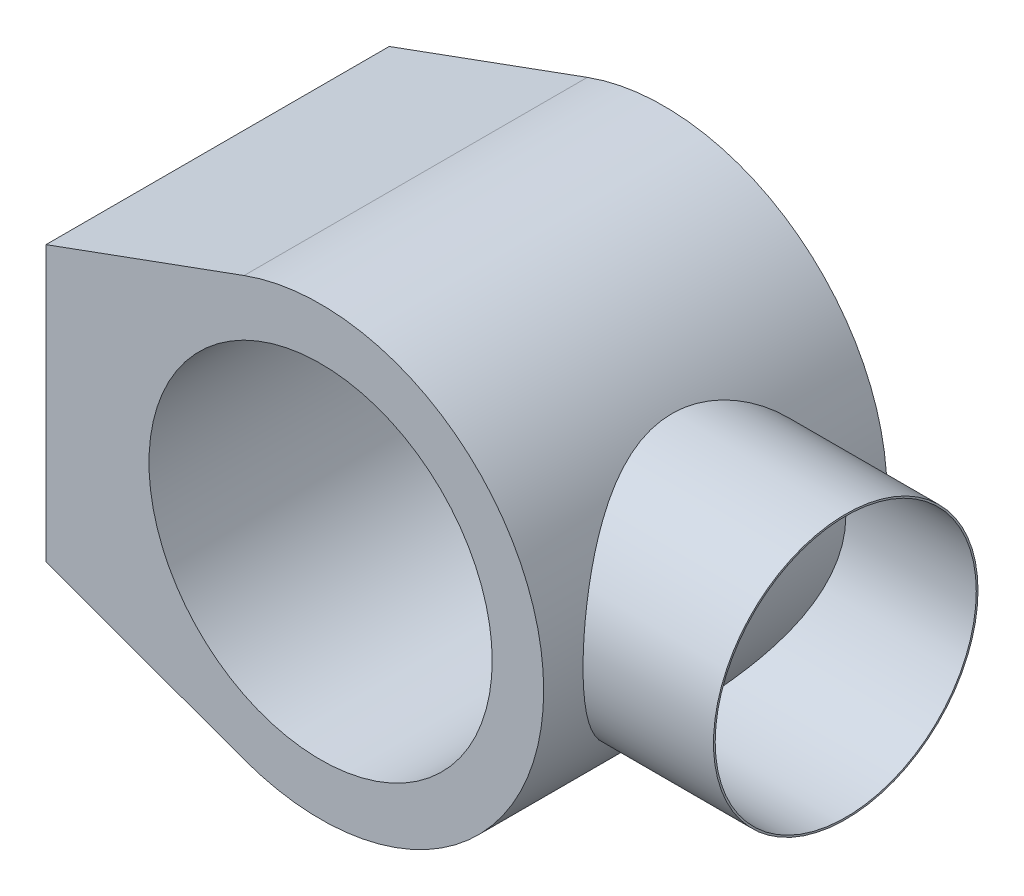
ISO-10303-21;
HEADER;
FILE_DESCRIPTION(('STEP AP214'),'2;1');
FILE_NAME('part.step','',(''),(''),'','','');
FILE_SCHEMA(('AUTOMOTIVE_DESIGN { 1 0 10303 214 1 1 1 1 }'));
ENDSEC;
DATA;
#1=APPLICATION_CONTEXT('core data for automotive mechanical design processes');
#2=APPLICATION_PROTOCOL_DEFINITION('international standard','automotive_design',2000,#1);
#3=PRODUCT_CONTEXT('',#1,'mechanical');
#4=PRODUCT('Part','Part','',(#3));
#5=PRODUCT_RELATED_PRODUCT_CATEGORY('part','',(#4));
#6=PRODUCT_DEFINITION_FORMATION('','',#4);
#7=PRODUCT_DEFINITION_CONTEXT('part definition',#1,'design');
#8=PRODUCT_DEFINITION('design','',#6,#7);
#9=PRODUCT_DEFINITION_SHAPE('','',#8);
#10=(LENGTH_UNIT() NAMED_UNIT(*) SI_UNIT(.MILLI.,.METRE.));
#11=(NAMED_UNIT(*) PLANE_ANGLE_UNIT() SI_UNIT($,.RADIAN.));
#12=(NAMED_UNIT(*) SI_UNIT($,.STERADIAN.) SOLID_ANGLE_UNIT());
#13=UNCERTAINTY_MEASURE_WITH_UNIT(LENGTH_MEASURE(1.E-05),#10,'distance_accuracy_value','');
#14=(GEOMETRIC_REPRESENTATION_CONTEXT(3) GLOBAL_UNCERTAINTY_ASSIGNED_CONTEXT((#13)) GLOBAL_UNIT_ASSIGNED_CONTEXT((#10,
#11,#12)) REPRESENTATION_CONTEXT('',''));
#15=CARTESIAN_POINT('',(0.,0.,0.));
#16=DIRECTION('',(0.,0.,1.));
#17=DIRECTION('',(1.,0.,0.));
#18=AXIS2_PLACEMENT_3D('',#15,#16,#17);
#19=CARTESIAN_POINT('',(0.,0.,50.));
#20=DIRECTION('',(0.,0.,1.));
#21=DIRECTION('',(1.,0.,0.));
#22=AXIS2_PLACEMENT_3D('',#19,#20,#21);
#23=PLANE('',#22);
#24=DIRECTION('',(0.939410286372225,-0.342794856813887,0.));
#25=VECTOR('',#24,1.);
#26=CARTESIAN_POINT('',(-80.,-40.,50.));
#27=LINE('',#26,#25);
#28=CARTESIAN_POINT('',(-80.,-40.,50.));
#29=VERTEX_POINT('',#28);
#30=CARTESIAN_POINT('',(-22.2816656929027,-61.0616686141946,50.));
#31=VERTEX_POINT('',#30);
#32=EDGE_CURVE('E290',#29,#31,#27,.T.);
#33=ORIENTED_EDGE('',*,*,#32,.T.);
#34=CARTESIAN_POINT('',(0.,0.,50.));
#35=DIRECTION('',(0.,0.,1.));
#36=DIRECTION('',(1.,0.,0.));
#37=AXIS2_PLACEMENT_3D('',#34,#35,#36);
#38=CIRCLE('',#37,65.);
#39=CARTESIAN_POINT('',(-22.2816656929027,61.0616686141947,50.));
#40=VERTEX_POINT('',#39);
#41=EDGE_CURVE('E285',#31,#40,#38,.T.);
#42=ORIENTED_EDGE('',*,*,#41,.T.);
#43=DIRECTION('',(-0.939410286372226,-0.342794856813887,0.));
#44=VECTOR('',#43,1.);
#45=CARTESIAN_POINT('',(-80.,40.,50.));
#46=LINE('',#45,#44);
#47=CARTESIAN_POINT('',(-80.,40.,50.));
#48=VERTEX_POINT('',#47);
#49=EDGE_CURVE('E288',#40,#48,#46,.T.);
#50=ORIENTED_EDGE('',*,*,#49,.T.);
#51=DIRECTION('',(0.,-1.,0.));
#52=VECTOR('',#51,1.);
#53=CARTESIAN_POINT('',(-80.,40.,50.));
#54=LINE('',#53,#52);
#55=EDGE_CURVE('E254',#48,#29,#54,.T.);
#56=ORIENTED_EDGE('',*,*,#55,.T.);
#57=EDGE_LOOP('',(#33,#42,#50,#56));
#58=FACE_BOUND('',#57,.T.);
#59=CARTESIAN_POINT('',(0.,0.,50.));
#60=DIRECTION('',(0.,0.,1.));
#61=DIRECTION('',(1.,0.,0.));
#62=AXIS2_PLACEMENT_3D('',#59,#60,#61);
#63=CIRCLE('',#62,50.);
#64=CARTESIAN_POINT('',(50.,0.,50.));
#65=VERTEX_POINT('',#64);
#66=EDGE_CURVE('E307',#65,#65,#63,.T.);
#67=ORIENTED_EDGE('',*,*,#66,.F.);
#68=EDGE_LOOP('',(#67));
#69=FACE_BOUND('',#68,.T.);
#70=ADVANCED_FACE('F233',(#58,#69),#23,.T.);
#71=CARTESIAN_POINT('',(0.,0.,-50.));
#72=DIRECTION('',(0.,0.,1.));
#73=DIRECTION('',(1.,0.,0.));
#74=AXIS2_PLACEMENT_3D('',#71,#72,#73);
#75=PLANE('',#74);
#76=DIRECTION('',(0.939410286372225,-0.342794856813887,0.));
#77=VECTOR('',#76,1.);
#78=CARTESIAN_POINT('',(-80.,-40.,-50.));
#79=LINE('',#78,#77);
#80=CARTESIAN_POINT('',(-80.,-40.,-50.));
#81=VERTEX_POINT('',#80);
#82=CARTESIAN_POINT('',(-22.2816656929027,-61.0616686141946,-50.));
#83=VERTEX_POINT('',#82);
#84=EDGE_CURVE('E304',#81,#83,#79,.T.);
#85=ORIENTED_EDGE('',*,*,#84,.F.);
#86=DIRECTION('',(0.,-1.,0.));
#87=VECTOR('',#86,1.);
#88=CARTESIAN_POINT('',(-80.,40.,-50.));
#89=LINE('',#88,#87);
#90=CARTESIAN_POINT('',(-80.,40.,-50.));
#91=VERTEX_POINT('',#90);
#92=EDGE_CURVE('E277',#91,#81,#89,.T.);
#93=ORIENTED_EDGE('',*,*,#92,.F.);
#94=DIRECTION('',(-0.939410286372226,-0.342794856813887,0.));
#95=VECTOR('',#94,1.);
#96=CARTESIAN_POINT('',(-80.,40.,-50.));
#97=LINE('',#96,#95);
#98=CARTESIAN_POINT('',(-22.2816656929027,61.0616686141947,-50.));
#99=VERTEX_POINT('',#98);
#100=EDGE_CURVE('E271',#99,#91,#97,.T.);
#101=ORIENTED_EDGE('',*,*,#100,.F.);
#102=CARTESIAN_POINT('',(0.,0.,-50.));
#103=DIRECTION('',(0.,0.,1.));
#104=DIRECTION('',(1.,0.,0.));
#105=AXIS2_PLACEMENT_3D('',#102,#103,#104);
#106=CIRCLE('',#105,65.);
#107=EDGE_CURVE('E295',#83,#99,#106,.T.);
#108=ORIENTED_EDGE('',*,*,#107,.F.);
#109=EDGE_LOOP('',(#85,#93,#101,#108));
#110=FACE_BOUND('',#109,.T.);
#111=CARTESIAN_POINT('',(0.,0.,-50.));
#112=DIRECTION('',(0.,0.,1.));
#113=DIRECTION('',(1.,0.,0.));
#114=AXIS2_PLACEMENT_3D('',#111,#112,#113);
#115=CIRCLE('',#114,50.);
#116=CARTESIAN_POINT('',(50.,0.,-50.));
#117=VERTEX_POINT('',#116);
#118=EDGE_CURVE('E321',#117,#117,#115,.T.);
#119=ORIENTED_EDGE('',*,*,#118,.T.);
#120=EDGE_LOOP('',(#119));
#121=FACE_BOUND('',#120,.T.);
#122=ADVANCED_FACE('F315',(#110,#121),#75,.F.);
#123=CARTESIAN_POINT('',(-80.,-40.,50.));
#124=DIRECTION('',(0.342794856813887,0.939410286372225,0.));
#125=DIRECTION('',(-0.939410286372225,0.342794856813887,0.));
#126=AXIS2_PLACEMENT_3D('',#123,#124,#125);
#127=PLANE('',#126);
#128=ORIENTED_EDGE('',*,*,#84,.T.);
#129=DIRECTION('',(0.,0.,-1.));
#130=VECTOR('',#129,1.);
#131=CARTESIAN_POINT('',(-22.2816656929027,-61.0616686141946,50.));
#132=LINE('',#131,#130);
#133=EDGE_CURVE('E246',#31,#83,#132,.T.);
#134=ORIENTED_EDGE('',*,*,#133,.F.);
#135=ORIENTED_EDGE('',*,*,#32,.F.);
#136=DIRECTION('',(0.,0.,-1.));
#137=VECTOR('',#136,1.);
#138=CARTESIAN_POINT('',(-80.,-40.,50.));
#139=LINE('',#138,#137);
#140=EDGE_CURVE('E300',#29,#81,#139,.T.);
#141=ORIENTED_EDGE('',*,*,#140,.T.);
#142=EDGE_LOOP('',(#128,#134,#135,#141));
#143=FACE_BOUND('',#142,.T.);
#144=ADVANCED_FACE('F235',(#143),#127,.F.);
#145=CARTESIAN_POINT('',(0.,0.,50.));
#146=DIRECTION('',(0.,0.,-1.));
#147=DIRECTION('',(-1.,0.,0.));
#148=AXIS2_PLACEMENT_3D('',#145,#146,#147);
#149=CYLINDRICAL_SURFACE('',#148,65.);
#150=CARTESIAN_POINT('',(65.,0.,-38.535));
#151=CARTESIAN_POINT('',(64.9999911949424,0.987976831353311,-38.5349902511514));
#152=CARTESIAN_POINT('',(64.9774152738882,1.97627275869706,-38.4969424597008));
#153=CARTESIAN_POINT('',(64.8876432189488,3.94543171340727,-38.3452225097814));
#154=CARTESIAN_POINT('',(64.8204190907879,4.92628968670687,-38.2315029052557));
#155=CARTESIAN_POINT('',(64.6428292345888,6.87486862388316,-37.9296260718127));
#156=CARTESIAN_POINT('',(64.5323640065708,7.84255392412636,-37.7412971509091));
#157=CARTESIAN_POINT('',(64.2710340997559,9.75530492921842,-37.2926969034477));
#158=CARTESIAN_POINT('',(64.1201753775438,10.7003739467875,-37.0324361840559));
#159=CARTESIAN_POINT('',(63.7824439438179,12.5573127748817,-36.4445325274687));
#160=CARTESIAN_POINT('',(63.5957538140062,13.4693241562554,-36.1172306583173));
#161=CARTESIAN_POINT('',(63.1900028197763,15.2599625528183,-35.3978935127097));
#162=CARTESIAN_POINT('',(62.9709408812313,16.1385884590296,-35.0058560882165));
#163=CARTESIAN_POINT('',(62.5051306064847,17.8578155326083,-34.1608224192051));
#164=CARTESIAN_POINT('',(62.258394169682,18.6984328263064,-33.7078523577501));
#165=CARTESIAN_POINT('',(61.7420488725879,20.3386024777687,-32.7443468133726));
#166=CARTESIAN_POINT('',(61.4724391569129,21.1381532979886,-32.2338091773819));
#167=CARTESIAN_POINT('',(60.8944485800029,22.752035334423,-31.1179179444586));
#168=CARTESIAN_POINT('',(60.5846772078036,23.5629321203387,-30.5083171571327));
#169=CARTESIAN_POINT('',(59.9512104449879,25.1310078287554,-29.2301554735673));
#170=CARTESIAN_POINT('',(59.6275144519006,25.888184423204,-28.5615920248973));
#171=CARTESIAN_POINT('',(58.9726752175314,27.347095337709,-27.1680220973247));
#172=CARTESIAN_POINT('',(58.6415235718192,28.0487626041554,-26.4429493931147));
#173=CARTESIAN_POINT('',(57.9793309358277,29.3931758548013,-24.940010876701));
#174=CARTESIAN_POINT('',(57.6482899523926,30.0359186942767,-24.1621422506953));
#175=CARTESIAN_POINT('',(56.9548534740239,31.332854524002,-22.4605244205008));
#176=CARTESIAN_POINT('',(56.59342401092,31.9792803253426,-21.5304385797799));
#177=CARTESIAN_POINT('',(55.8914135552976,33.1909683917639,-19.6110682249147));
#178=CARTESIAN_POINT('',(55.5508358856725,33.7562177399664,-18.6217743249282));
#179=CARTESIAN_POINT('',(54.9030315892671,34.7999137155156,-16.5896122167423));
#180=CARTESIAN_POINT('',(54.595762148095,35.2784723194759,-15.5468153851819));
#181=CARTESIAN_POINT('',(54.0266654398783,36.143990706523,-13.4120636687325));
#182=CARTESIAN_POINT('',(53.7648217458336,36.5309836203778,-12.3201267346954));
#183=CARTESIAN_POINT('',(53.3539859684097,37.1274886194685,-10.3578312103774));
#184=CARTESIAN_POINT('',(53.1929493804508,37.3573298419664,-9.49612757765819));
#185=CARTESIAN_POINT('',(52.9095509002482,37.7576449243597,-7.75279893885493));
#186=CARTESIAN_POINT('',(52.7871831120935,37.9281278351426,-6.87117699174275));
#187=CARTESIAN_POINT('',(52.585424148517,38.2073674275062,-5.09424243371309));
#188=CARTESIAN_POINT('',(52.5059890550397,38.3161871930235,-4.19894478038054));
#189=CARTESIAN_POINT('',(52.3928244581682,38.470783862046,-2.39999272392233));
#190=CARTESIAN_POINT('',(52.3590957784487,38.5165596294362,-1.49633817049252));
#191=CARTESIAN_POINT('',(52.3386250056153,38.5443725132486,0.314119950689428));
#192=CARTESIAN_POINT('',(52.3519676509242,38.5262946795012,1.22092625870764));
#193=CARTESIAN_POINT('',(52.425309688552,38.4264320661922,3.02910272984153));
#194=CARTESIAN_POINT('',(52.4853092987791,38.3446469890902,3.93047286754814));
#195=CARTESIAN_POINT('',(52.6497496558937,38.1185427067294,5.72175599350346));
#196=CARTESIAN_POINT('',(52.7542183455826,37.9741841814769,6.61166141487832));
#197=CARTESIAN_POINT('',(53.0038756591501,37.624926610728,8.37364296759673));
#198=CARTESIAN_POINT('',(53.1490652346887,37.4200261503412,9.24571868174327));
#199=CARTESIAN_POINT('',(53.4736705035497,36.9546485442773,10.9580619180162));
#200=CARTESIAN_POINT('',(53.6527074780226,36.6947829052219,11.7985684806562));
#201=CARTESIAN_POINT('',(54.0407872995581,36.1208142055593,13.453633748011));
#202=CARTESIAN_POINT('',(54.249829638269,35.8067120638101,14.2681928920421));
#203=CARTESIAN_POINT('',(54.6925622377679,35.1267444450613,15.8686557781167));
#204=CARTESIAN_POINT('',(54.9262580449052,34.7608673137721,16.6545530182791));
#205=CARTESIAN_POINT('',(55.4128738742391,33.979775448213,18.1952523282263));
#206=CARTESIAN_POINT('',(55.6657954137918,33.5645568182948,18.9500519364224));
#207=CARTESIAN_POINT('',(56.2301672857619,32.6117313991161,20.5531810573438));
#208=CARTESIAN_POINT('',(56.5442222783176,32.0653433324212,21.3953855691914));
#209=CARTESIAN_POINT('',(57.1835162711493,30.9108544286079,23.0318967649082));
#210=CARTESIAN_POINT('',(57.5087562291142,30.3027482982696,23.826199331161));
#211=CARTESIAN_POINT('',(58.1631348258033,29.0269543811981,25.3649714268417));
#212=CARTESIAN_POINT('',(58.4922765320987,28.3592165874688,26.1093981974321));
#213=CARTESIAN_POINT('',(59.1470182420437,26.9670549755447,27.5449452888638));
#214=CARTESIAN_POINT('',(59.4726180550154,26.2426281225284,28.2360627518788));
#215=CARTESIAN_POINT('',(60.1560116268375,24.6396150029807,29.6500315716697));
#216=CARTESIAN_POINT('',(60.512336842441,23.7533334216756,30.3649040735003));
#217=CARTESIAN_POINT('',(61.2021030720994,21.9149829069974,31.7172172151811));
#218=CARTESIAN_POINT('',(61.5355417542829,20.9629072897518,32.3546499699018));
#219=CARTESIAN_POINT('',(62.1702161885582,18.9981418968875,33.5460286932068));
#220=CARTESIAN_POINT('',(62.471464630969,17.9854762550367,34.1000075972592));
#221=CARTESIAN_POINT('',(63.033180262524,15.9052910760494,35.1184927464048));
#222=CARTESIAN_POINT('',(63.2936525345319,14.8377783978186,35.5830101447897));
#223=CARTESIAN_POINT('',(63.7505229620954,12.7263777457139,36.3892618404304));
#224=CARTESIAN_POINT('',(63.9499815589726,11.6854496494908,36.7370064395608));
#225=CARTESIAN_POINT('',(64.3005658226089,9.57006954796787,37.3439479527016));
#226=CARTESIAN_POINT('',(64.4516929865986,8.49561858228491,37.60314760971));
#227=CARTESIAN_POINT('',(64.7009095521158,6.32346568867483,38.0287216155453));
#228=CARTESIAN_POINT('',(64.7990493321286,5.22578688071405,38.1951841402899));
#229=CARTESIAN_POINT('',(64.9393877775687,3.01666035850831,38.4327935417035));
#230=CARTESIAN_POINT('',(64.9815938780368,1.9052144940919,38.5039530866307));
#231=CARTESIAN_POINT('',(65.0069469332665,-0.172962373037184,38.5467167764841));
#232=CARTESIAN_POINT('',(64.9971680793765,-1.13938702649722,38.5302455835157));
#233=CARTESIAN_POINT('',(64.9347674364242,-3.06681472572754,38.424889182589));
#234=CARTESIAN_POINT('',(64.8821502070854,-4.02781833755292,38.336011681569));
#235=CARTESIAN_POINT('',(64.7353523384021,-5.93727243395648,38.0870337039576));
#236=CARTESIAN_POINT('',(64.6411726523484,-6.88572320593708,37.926934860923));
#237=CARTESIAN_POINT('',(64.4134755856428,-8.76348661994124,37.5375410984916));
#238=CARTESIAN_POINT('',(64.2799571652862,-9.69279875544484,37.3082443502222));
#239=CARTESIAN_POINT('',(63.9797530559851,-11.5073685588892,36.7885719627438));
#240=CARTESIAN_POINT('',(63.8138087666919,-12.3931396073621,36.4995545779764));
#241=CARTESIAN_POINT('',(63.4505545973374,-14.1357468665415,35.8606767818825));
#242=CARTESIAN_POINT('',(63.2532455817741,-14.9925838739607,35.5108180474855));
#243=CARTESIAN_POINT('',(62.8311229814591,-16.6733600456623,34.7533470425395));
#244=CARTESIAN_POINT('',(62.6063067578894,-17.497296043617,34.3457292304598));
#245=CARTESIAN_POINT('',(62.13338151108,-19.1088533110999,33.4759098638419));
#246=CARTESIAN_POINT('',(61.8852710483267,-19.8964723318577,33.0137049355288));
#247=CARTESIAN_POINT('',(61.3433602974475,-21.5126028675456,31.9869286213026));
#248=CARTESIAN_POINT('',(61.0474924496615,-22.336835493304,31.4167096882254));
#249=CARTESIAN_POINT('',(60.4389614761619,-23.93455429077,30.2172370252016));
#250=CARTESIAN_POINT('',(60.1262973678833,-24.7080374877924,29.5879798399631));
#251=CARTESIAN_POINT('',(59.4902751451785,-26.202428832304,28.273141132615));
#252=CARTESIAN_POINT('',(59.166905938001,-26.9232797949273,27.587500019294));
#253=CARTESIAN_POINT('',(58.5165022607872,-28.3090968942259,26.1634949973498));
#254=CARTESIAN_POINT('',(58.1894676135919,-28.9740603164152,25.4251285310475));
#255=CARTESIAN_POINT('',(57.4977754958128,-30.325769571008,23.8022084907858));
#256=CARTESIAN_POINT('',(57.1335637045106,-31.0047220663502,22.9109524486797));
#257=CARTESIAN_POINT('',(56.4199743194738,-32.2850401574689,21.0684847655453));
#258=CARTESIAN_POINT('',(56.070599063944,-32.8863935540226,20.1172637324254));
#259=CARTESIAN_POINT('',(55.3983851108793,-34.0065475327486,18.1596135414526));
#260=CARTESIAN_POINT('',(55.0755227704455,-34.5254220605492,17.1532349358583));
#261=CARTESIAN_POINT('',(54.4680273628646,-35.4760823807614,15.089194818302));
#262=CARTESIAN_POINT('',(54.1833825688909,-35.9078949081258,14.0315491735231));
#263=CARTESIAN_POINT('',(53.7205950366889,-36.5954960085083,12.1047197376352));
#264=CARTESIAN_POINT('',(53.5327308586644,-36.8691574322931,11.2442162752271));
#265=CARTESIAN_POINT('',(53.1936119065039,-37.35676634061,9.49938852608433));
#266=CARTESIAN_POINT('',(53.0423521450732,-37.5707219605735,8.61506750272139));
#267=CARTESIAN_POINT('',(52.781652512638,-37.9360991744812,6.82853516326083));
#268=CARTESIAN_POINT('',(52.6721654193987,-38.0875913963901,5.92634526859163));
#269=CARTESIAN_POINT('',(52.4987672374539,-38.3262484778434,4.1090907296477));
#270=CARTESIAN_POINT('',(52.4348565311965,-38.4134127975892,3.19402597740104));
#271=CARTESIAN_POINT('',(52.3549677413944,-38.5222273797041,1.35483975428445));
#272=CARTESIAN_POINT('',(52.3391494122421,-38.543659292683,0.430698306644773));
#273=CARTESIAN_POINT('',(52.3565355388121,-38.5200387303254,-1.41626769469411));
#274=CARTESIAN_POINT('',(52.3897401243943,-38.474986078874,-2.33909224489842));
#275=CARTESIAN_POINT('',(52.5038703449959,-38.3190923556067,-4.17661321974098));
#276=CARTESIAN_POINT('',(52.5848199299263,-38.2082182661701,-5.09130533106577));
#277=CARTESIAN_POINT('',(52.791349386482,-37.9223468202672,-6.90544254589293));
#278=CARTESIAN_POINT('',(52.9169296178298,-37.7473489469638,-7.80488752644245));
#279=CARTESIAN_POINT('',(53.2023861828065,-37.3438684628,-9.54720988231049));
#280=CARTESIAN_POINT('',(53.360689161589,-37.1178061243641,-10.3909106476192));
#281=CARTESIAN_POINT('',(53.709514483391,-36.6112349072273,-12.0548775666491));
#282=CARTESIAN_POINT('',(53.9000356504713,-36.3307280156555,-12.8751445744076));
#283=CARTESIAN_POINT('',(54.3081955438559,-35.7177188917479,-14.4891788837883));
#284=CARTESIAN_POINT('',(54.5258399785147,-35.3852057104163,-15.2829405623865));
#285=CARTESIAN_POINT('',(54.9830147548226,-34.6705630384109,-16.8414141395256));
#286=CARTESIAN_POINT('',(55.2225478235101,-34.2884273629172,-17.6061224015411));
#287=CARTESIAN_POINT('',(55.6135053276522,-33.6483790725803,-18.7876235738843));
#288=CARTESIAN_POINT('',(55.7593888213826,-33.4062109256189,-19.2148828398224));
#289=CARTESIAN_POINT('',(56.0557259084272,-32.906533837033,-20.0585787093483));
#290=CARTESIAN_POINT('',(56.2061785844451,-32.6490279647186,-20.4750174544887));
#291=CARTESIAN_POINT('',(56.6630598112528,-31.8539042823748,-21.7078668433497));
#292=CARTESIAN_POINT('',(56.9750122968427,-31.2936792139708,-22.5078128390879));
#293=CARTESIAN_POINT('',(57.6064987610449,-30.1154188416892,-24.061571703847));
#294=CARTESIAN_POINT('',(57.9260379383009,-29.4973429902626,-24.8153515935825));
#295=CARTESIAN_POINT('',(58.565695213028,-28.206002730897,-26.2738722465142));
#296=CARTESIAN_POINT('',(58.8858133441619,-27.532735005908,-26.9786100575521));
#297=CARTESIAN_POINT('',(59.5688114462661,-26.0257908961314,-28.440624618795));
#298=CARTESIAN_POINT('',(59.9307136176125,-25.1833546830858,-29.1893637246979));
#299=CARTESIAN_POINT('',(60.6370735775391,-23.4315472595737,-30.6134473222753));
#300=CARTESIAN_POINT('',(60.9815292976103,-22.5221681433478,-31.2887831218376));
#301=CARTESIAN_POINT('',(61.6439525670666,-20.6402135959124,-32.5609913694733));
#302=CARTESIAN_POINT('',(61.9619082166694,-19.6676101191993,-33.1578286367998));
#303=CARTESIAN_POINT('',(62.5623228419974,-17.6648942069813,-34.2667145263033));
#304=CARTESIAN_POINT('',(62.8447866431246,-16.6347896167785,-34.7787746776241));
#305=CARTESIAN_POINT('',(63.3560797465706,-14.5636577811176,-35.6942257492012));
#306=CARTESIAN_POINT('',(63.586546296721,-13.5245526080168,-36.101021900906));
#307=CARTESIAN_POINT('',(63.8969369605214,-11.936218017771,-36.6440529178905));
#308=CARTESIAN_POINT('',(63.9945368289996,-11.4016814715244,-36.8139054798722));
#309=CARTESIAN_POINT('',(64.1772440442244,-10.3237549532887,-37.1306028503439));
#310=CARTESIAN_POINT('',(64.2623530227239,-9.78036614804074,-37.2774506642385));
#311=CARTESIAN_POINT('',(64.4191624425642,-8.68764891413363,-37.5471263319596));
#312=CARTESIAN_POINT('',(64.4909051953814,-8.13834525866304,-37.670030040549));
#313=CARTESIAN_POINT('',(64.6207451973013,-7.03339600238696,-37.8918860754462));
#314=CARTESIAN_POINT('',(64.6788443382848,-6.47775129207666,-37.9908417225512));
#315=CARTESIAN_POINT('',(64.7809010590083,-5.36177242416769,-38.1643326145989));
#316=CARTESIAN_POINT('',(64.8248684552073,-4.80144180039433,-38.238884811792));
#317=CARTESIAN_POINT('',(64.898347964846,-3.67718554443427,-38.3633199760748));
#318=CARTESIAN_POINT('',(64.927862482216,-3.11326052591665,-38.4132070456996));
#319=CARTESIAN_POINT('',(64.9666609614405,-2.12436499278918,-38.4787443154014));
#320=CARTESIAN_POINT('',(64.9791568068887,-1.69987253189846,-38.4998339267692));
#321=CARTESIAN_POINT('',(64.9958283145778,-0.850273087843481,-38.5279640251572));
#322=CARTESIAN_POINT('',(65.0000037891698,-0.425166091035992,-38.5350041953209));
#323=CARTESIAN_POINT('',(65.,0.,-38.535));
#324=B_SPLINE_CURVE_WITH_KNOTS('',3,(#150,#151,#152,#153,#154,#155,#156,#157,#158,#159,#160,
#161,#162,#163,#164,#165,#166,#167,#168,#169,#170,#171,#172,#173,#174,#175,#176,#177,#178,#179,
#180,#181,#182,#183,#184,#185,#186,#187,#188,#189,#190,#191,#192,#193,#194,#195,#196,#197,#198,
#199,#200,#201,#202,#203,#204,#205,#206,#207,#208,#209,#210,#211,#212,#213,#214,#215,#216,#217,
#218,#219,#220,#221,#222,#223,#224,#225,#226,#227,#228,#229,#230,#231,#232,#233,#234,#235,#236,
#237,#238,#239,#240,#241,#242,#243,#244,#245,#246,#247,#248,#249,#250,#251,#252,#253,#254,#255,
#256,#257,#258,#259,#260,#261,#262,#263,#264,#265,#266,#267,#268,#269,#270,#271,#272,#273,#274,
#275,#276,#277,#278,#279,#280,#281,#282,#283,#284,#285,#286,#287,#288,#289,#290,#291,#292,#293,
#294,#295,#296,#297,#298,#299,#300,#301,#302,#303,#304,#305,#306,#307,#308,#309,#310,#311,#312,
#313,#314,#315,#316,#317,#318,#319,#320,#321,#322,#323),.UNSPECIFIED.,.T.,.F.,(4,2,2,2,2,2,2,2,
2,2,2,2,2,2,2,2,2,2,2,2,2,2,2,2,2,2,2,2,2,2,2,2,2,2,2,2,2,2,2,2,2,2,2,2,2,2,2,2,2,2,2,2,2,2,2,2,
2,2,2,2,2,2,2,2,2,2,2,2,2,2,2,2,2,2,2,2,2,2,2,2,2,2,2,2,2,2,4),(0.,2.96350118442673,
5.92886223045346,8.90108721808222,11.8728741507873,14.8299019314972,17.7870278511915,
20.7428871139721,23.6988569646846,26.8777990659305,30.0568788477888,33.2397420159151,
36.4227749507614,39.9852152021957,43.5482216860811,47.1065925726253,50.663673975512,
53.379701713662,56.0953151334605,58.8081453297794,61.5210244133276,64.2387897478915,
66.9565677756694,69.6760560861517,72.3956079572372,75.0863611208314,77.7770687029905,
80.468382916162,83.159909757416,86.3124636387378,89.4652881261687,92.6207818494451,
95.7764446162718,99.3512766368651,102.926472352218,106.500253381795,110.073588574236,
113.415115475689,116.756538851944,120.094779704386,123.432576773271,126.328824271085,
129.224763532154,132.120636374404,135.016585760105,137.852766711298,140.688869503112,
143.525244581224,146.361795054276,149.493642417523,152.625673190764,155.761057778205,
158.896594564956,162.426799272065,165.957558282307,169.485133750443,173.011624317179,
175.775833980465,178.539666812197,181.300365924455,184.061088202474,186.830971147859,
189.600861430566,192.37214233247,195.143445571363,197.803860284357,200.464177915212,
203.125056384232,205.786266817169,207.322913555712,208.85925381453,211.931926529589,
215.006769239152,218.081796883463,221.628788012645,225.176198705111,228.725193864892,
232.273705986954,235.686599348629,237.393950891415,239.101079194665,240.802708098208,
242.504100907204,244.20430929553,245.904234794044,247.179519556858,248.454833080797),.UNSPECIFIED.);
#325=CARTESIAN_POINT('',(65.,0.,-38.535));
#326=VERTEX_POINT('',#325);
#327=EDGE_CURVE('E331',#326,#326,#324,.T.);
#328=ORIENTED_EDGE('',*,*,#327,.F.);
#329=EDGE_LOOP('',(#328));
#330=FACE_BOUND('',#329,.T.);
#331=ORIENTED_EDGE('',*,*,#107,.T.);
#332=DIRECTION('',(0.,0.,-1.));
#333=VECTOR('',#332,1.);
#334=CARTESIAN_POINT('',(-22.2816656929027,61.0616686141947,50.));
#335=LINE('',#334,#333);
#336=EDGE_CURVE('E293',#40,#99,#335,.T.);
#337=ORIENTED_EDGE('',*,*,#336,.F.);
#338=ORIENTED_EDGE('',*,*,#41,.F.);
#339=ORIENTED_EDGE('',*,*,#133,.T.);
#340=EDGE_LOOP('',(#331,#337,#338,#339));
#341=FACE_BOUND('',#340,.T.);
#342=ADVANCED_FACE('F294',(#330,#341),#149,.T.);
#343=CARTESIAN_POINT('',(-80.,40.,50.));
#344=DIRECTION('',(0.342794856813887,-0.939410286372225,0.));
#345=DIRECTION('',(0.939410286372225,0.342794856813887,0.));
#346=AXIS2_PLACEMENT_3D('',#343,#344,#345);
#347=PLANE('',#346);
#348=ORIENTED_EDGE('',*,*,#100,.T.);
#349=DIRECTION('',(0.,0.,-1.));
#350=VECTOR('',#349,1.);
#351=CARTESIAN_POINT('',(-80.,40.,50.));
#352=LINE('',#351,#350);
#353=EDGE_CURVE('E296',#48,#91,#352,.T.);
#354=ORIENTED_EDGE('',*,*,#353,.F.);
#355=ORIENTED_EDGE('',*,*,#49,.F.);
#356=ORIENTED_EDGE('',*,*,#336,.T.);
#357=EDGE_LOOP('',(#348,#354,#355,#356));
#358=FACE_BOUND('',#357,.T.);
#359=ADVANCED_FACE('F298',(#358),#347,.F.);
#360=CARTESIAN_POINT('',(-80.,40.,50.));
#361=DIRECTION('',(1.,0.,0.));
#362=DIRECTION('',(0.,1.,0.));
#363=AXIS2_PLACEMENT_3D('',#360,#361,#362);
#364=PLANE('',#363);
#365=ORIENTED_EDGE('',*,*,#92,.T.);
#366=ORIENTED_EDGE('',*,*,#140,.F.);
#367=ORIENTED_EDGE('',*,*,#55,.F.);
#368=ORIENTED_EDGE('',*,*,#353,.T.);
#369=EDGE_LOOP('',(#365,#366,#367,#368));
#370=FACE_BOUND('',#369,.T.);
#371=ADVANCED_FACE('F355',(#370),#364,.F.);
#372=CARTESIAN_POINT('',(0.,0.,50.));
#373=DIRECTION('',(0.,0.,-1.));
#374=DIRECTION('',(-1.,0.,0.));
#375=AXIS2_PLACEMENT_3D('',#372,#373,#374);
#376=CYLINDRICAL_SURFACE('',#375,50.);
#377=ORIENTED_EDGE('',*,*,#66,.T.);
#378=EDGE_LOOP('',(#377));
#379=FACE_BOUND('',#378,.T.);
#380=ORIENTED_EDGE('',*,*,#118,.F.);
#381=EDGE_LOOP('',(#380));
#382=FACE_BOUND('',#381,.T.);
#383=ADVANCED_FACE('F345',(#379,#382),#376,.F.);
#384=CARTESIAN_POINT('',(103.,0.,0.));
#385=DIRECTION('',(1.,0.,0.));
#386=DIRECTION('',(0.,0.,-1.));
#387=AXIS2_PLACEMENT_3D('',#384,#385,#386);
#388=PLANE('',#387);
#389=CARTESIAN_POINT('',(103.,0.,0.));
#390=DIRECTION('',(1.,0.,0.));
#391=DIRECTION('',(0.,0.,-1.));
#392=AXIS2_PLACEMENT_3D('',#389,#390,#391);
#393=CIRCLE('',#392,38.035);
#394=CARTESIAN_POINT('',(103.,0.,-38.035));
#395=VERTEX_POINT('',#394);
#396=EDGE_CURVE('E328',#395,#395,#393,.T.);
#397=ORIENTED_EDGE('',*,*,#396,.F.);
#398=EDGE_LOOP('',(#397));
#399=FACE_BOUND('',#398,.T.);
#400=CARTESIAN_POINT('',(103.,0.,0.));
#401=DIRECTION('',(1.,0.,0.));
#402=DIRECTION('',(0.,0.,-1.));
#403=AXIS2_PLACEMENT_3D('',#400,#401,#402);
#404=CIRCLE('',#403,38.535);
#405=CARTESIAN_POINT('',(103.,0.,-38.535));
#406=VERTEX_POINT('',#405);
#407=EDGE_CURVE('E323',#406,#406,#404,.T.);
#408=ORIENTED_EDGE('',*,*,#407,.T.);
#409=EDGE_LOOP('',(#408));
#410=FACE_BOUND('',#409,.T.);
#411=ADVANCED_FACE('F343',(#399,#410),#388,.T.);
#412=CARTESIAN_POINT('',(-80.002,0.,0.));
#413=DIRECTION('',(1.,0.,0.));
#414=DIRECTION('',(0.,0.,-1.));
#415=AXIS2_PLACEMENT_3D('',#412,#413,#414);
#416=CYLINDRICAL_SURFACE('',#415,38.535);
#417=ORIENTED_EDGE('',*,*,#407,.F.);
#418=EDGE_LOOP('',(#417));
#419=FACE_BOUND('',#418,.T.);
#420=ORIENTED_EDGE('',*,*,#327,.T.);
#421=EDGE_LOOP('',(#420));
#422=FACE_BOUND('',#421,.T.);
#423=ADVANCED_FACE('F339',(#419,#422),#416,.T.);
#424=CARTESIAN_POINT('',(-80.002,0.,0.));
#425=DIRECTION('',(1.,0.,0.));
#426=DIRECTION('',(0.,0.,-1.));
#427=AXIS2_PLACEMENT_3D('',#424,#425,#426);
#428=CYLINDRICAL_SURFACE('',#427,38.035);
#429=ORIENTED_EDGE('',*,*,#396,.T.);
#430=EDGE_LOOP('',(#429));
#431=FACE_BOUND('',#430,.T.);
#432=CARTESIAN_POINT('',(65.,0.,-38.035));
#433=CARTESIAN_POINT('',(64.9999923392851,-0.977154430693574,-38.0349914919489));
#434=CARTESIAN_POINT('',(64.9779060460667,-1.954680747794,-37.9972805669894));
#435=CARTESIAN_POINT('',(64.8900824222465,-3.90241516293377,-37.8468973813591));
#436=CARTESIAN_POINT('',(64.8243157378537,-4.87261789570465,-37.7341747117217));
#437=CARTESIAN_POINT('',(64.6505672318478,-6.80020030637102,-37.4349028409359));
#438=CARTESIAN_POINT('',(64.5424824068693,-7.7575427562889,-37.24817349205));
#439=CARTESIAN_POINT('',(64.2867919547405,-9.6498713944958,-36.8033412294744));
#440=CARTESIAN_POINT('',(64.1391926352476,-10.5848611250005,-36.5452497070385));
#441=CARTESIAN_POINT('',(63.8087753392266,-12.4220402645132,-35.9621803298509));
#442=CARTESIAN_POINT('',(63.626135279014,-13.3243691046077,-35.6375398246347));
#443=CARTESIAN_POINT('',(63.2292239343072,-15.0960080722167,-34.9239727805895));
#444=CARTESIAN_POINT('',(63.0149515029114,-15.9653170010835,-34.5350439107822));
#445=CARTESIAN_POINT('',(62.5593982946298,-17.6662555651901,-33.6966366112118));
#446=CARTESIAN_POINT('',(62.3181302683511,-18.4979027303368,-33.2471867465926));
#447=CARTESIAN_POINT('',(61.8133257421786,-20.1205077589124,-32.2910713267907));
#448=CARTESIAN_POINT('',(61.5497884342724,-20.9114641442518,-31.7844036953099));
#449=CARTESIAN_POINT('',(60.9852620401258,-22.5070235471806,-30.6774620226618));
#450=CARTESIAN_POINT('',(60.6829451715539,-23.308272241205,-30.0730297614349));
#451=CARTESIAN_POINT('',(60.0649504006292,-24.8575425541567,-28.8056521626121));
#452=CARTESIAN_POINT('',(59.7492719236775,-25.6055618803065,-28.1427043072943));
#453=CARTESIAN_POINT('',(59.1109456501747,-27.046586025585,-26.7608130869078));
#454=CARTESIAN_POINT('',(58.7882901148367,-27.7395253005514,-26.0418049676507));
#455=CARTESIAN_POINT('',(58.1434465246993,-29.0668912954434,-24.5514350307281));
#456=CARTESIAN_POINT('',(57.8212584951825,-29.7013149590374,-23.7800704820801));
#457=CARTESIAN_POINT('',(57.1480385873437,-30.9787221753103,-22.0957541464497));
#458=CARTESIAN_POINT('',(56.7979693681219,-31.6142429710797,-21.1767360655403));
#459=CARTESIAN_POINT('',(56.1185900180632,-32.8050912114315,-19.2805782730181));
#460=CARTESIAN_POINT('',(55.7892830645956,-33.360406398391,-18.3034297096187));
#461=CARTESIAN_POINT('',(55.1635113396593,-34.3852754872363,-16.2966784992409));
#462=CARTESIAN_POINT('',(54.8670050042875,-34.8549384262366,-15.2671447068546));
#463=CARTESIAN_POINT('',(54.31845948884,-35.7037913188979,-13.1601407324594));
#464=CARTESIAN_POINT('',(54.066404776841,-36.0830128902261,-12.0826874595167));
#465=CARTESIAN_POINT('',(53.6702535324729,-36.6687640943888,-10.1410336621337));
#466=CARTESIAN_POINT('',(53.5146684697728,-36.8949499470389,-9.28506297759516));
#467=CARTESIAN_POINT('',(53.2415818910122,-37.2879524555278,-7.55363920647797));
#468=CARTESIAN_POINT('',(53.1240746458456,-37.4547780429544,-6.67818907193696));
#469=CARTESIAN_POINT('',(52.9312615933397,-37.7267732512324,-4.91401718162156));
#470=CARTESIAN_POINT('',(52.8559143775193,-37.8320033742436,-4.02530933136878));
#471=CARTESIAN_POINT('',(52.7499988458543,-37.9795464881396,-2.23997657281297));
#472=CARTESIAN_POINT('',(52.7194313717001,-38.0218582963977,-1.34335151601501));
#473=CARTESIAN_POINT('',(52.7042315622659,-38.0429252347353,0.452504453666369));
#474=CARTESIAN_POINT('',(52.719674292724,-38.0215765024712,1.35173723108744));
#475=CARTESIAN_POINT('',(52.796064241736,-37.915429770997,3.14448098248979));
#476=CARTESIAN_POINT('',(52.8570116621006,-37.8306314903916,4.03799193107736));
#477=CARTESIAN_POINT('',(53.0221842870667,-37.5987783245207,5.81335495093389));
#478=CARTESIAN_POINT('',(53.1264359961032,-37.4516853106187,6.69519954013143));
#479=CARTESIAN_POINT('',(53.3745435015728,-37.0972339713765,8.44096687986464));
#480=CARTESIAN_POINT('',(53.5184002335947,-36.8898742223497,9.30488920650449));
#481=CARTESIAN_POINT('',(53.8397410678625,-36.419262342606,11.0031251033465));
#482=CARTESIAN_POINT('',(54.0169441551271,-36.1564752182941,11.8376214724609));
#483=CARTESIAN_POINT('',(54.400598870203,-35.5766159207253,13.48052489805));
#484=CARTESIAN_POINT('',(54.6070500551033,-35.2595445694925,14.2889323493679));
#485=CARTESIAN_POINT('',(55.0439168145052,-34.5735812700984,15.8769330540477));
#486=CARTESIAN_POINT('',(55.2743379446276,-34.2046773014821,16.6565195704502));
#487=CARTESIAN_POINT('',(55.7537866679708,-33.4174754667517,18.1843953860959));
#488=CARTESIAN_POINT('',(56.0028157137127,-32.9991737432002,18.9326822349824));
#489=CARTESIAN_POINT('',(56.5571261525341,-32.0413271146451,20.5185359078805));
#490=CARTESIAN_POINT('',(56.8648462575885,-31.4932076885089,21.35008240832));
#491=CARTESIAN_POINT('',(57.4907240464342,-30.3356168228167,22.9651673323307));
#492=CARTESIAN_POINT('',(57.8088826123457,-29.7261401891149,23.7487016824242));
#493=CARTESIAN_POINT('',(58.4484568236667,-28.4480037882065,25.2657234701866));
#494=CARTESIAN_POINT('',(58.7698749377027,-27.7792956505658,25.9991691218866));
#495=CARTESIAN_POINT('',(59.4086360008797,-26.3856335228267,27.412490163798));
#496=CARTESIAN_POINT('',(59.7259787421046,-25.6606766762292,28.092362829854));
#497=CARTESIAN_POINT('',(60.389100760686,-24.0623371337039,29.4774420649357));
#498=CARTESIAN_POINT('',(60.7334326543166,-23.1817570571576,30.1750689966954));
#499=CARTESIAN_POINT('',(61.3990869517175,-21.3564024769328,31.4933771108029));
#500=CARTESIAN_POINT('',(61.7204071042343,-20.411621710032,32.114050769094));
#501=CARTESIAN_POINT('',(62.3309999850557,-18.4631567440606,33.2724654307009));
#502=CARTESIAN_POINT('',(62.6202862220208,-17.4594976491554,33.8102414296506));
#503=CARTESIAN_POINT('',(63.1585371877222,-15.3991021656832,34.797027269234));
#504=CARTESIAN_POINT('',(63.4075069475024,-14.3423724213326,35.2460481870511));
#505=CARTESIAN_POINT('',(63.8424767991298,-12.255503755709,36.0224846046978));
#506=CARTESIAN_POINT('',(64.0315670558329,-11.228283776271,36.3560088283696));
#507=CARTESIAN_POINT('',(64.3625556067959,-9.14201974928494,36.9358436130783));
#508=CARTESIAN_POINT('',(64.5044554655672,-8.08297675803999,37.1821570654463));
#509=CARTESIAN_POINT('',(64.7366689435213,-5.9431332682974,37.5835646157414));
#510=CARTESIAN_POINT('',(64.8270290770282,-4.86235330235907,37.7387409681772));
#511=CARTESIAN_POINT('',(64.9535046537498,-2.68834631359064,37.9555906255113));
#512=CARTESIAN_POINT('',(64.9896268779142,-1.5951208639462,38.0172756189259));
#513=CARTESIAN_POINT('',(65.0054254979337,0.452373752632004,38.0442693092027));
#514=CARTESIAN_POINT('',(64.9917526585006,1.40646543145989,38.0209334469458));
#515=CARTESIAN_POINT('',(64.9227113431485,3.30862133553311,37.9027970779974));
#516=CARTESIAN_POINT('',(64.8673471758769,4.2566861734211,37.8080039561537));
#517=CARTESIAN_POINT('',(64.716264872879,6.13982711778165,37.5481995805815));
#518=CARTESIAN_POINT('',(64.6205473867482,7.07490343308926,37.3831894571846));
#519=CARTESIAN_POINT('',(64.3910119330063,8.92564536661915,36.9849982181372));
#520=CARTESIAN_POINT('',(64.2571929000857,9.84131044133878,36.7518151963847));
#521=CARTESIAN_POINT('',(63.9570257169597,11.632263420128,36.2244190895928));
#522=CARTESIAN_POINT('',(63.7912603828476,12.5079708475646,35.931294440839));
#523=CARTESIAN_POINT('',(63.4292901750031,14.2302324532278,35.2846685467048));
#524=CARTESIAN_POINT('',(63.2330860503144,15.0767873482194,34.9311687870253));
#525=CARTESIAN_POINT('',(62.8140968805942,16.7368524232168,34.1668574120429));
#526=CARTESIAN_POINT('',(62.5913089744604,17.5503590337199,33.7560396270315));
#527=CARTESIAN_POINT('',(62.1233580340218,19.1409455626325,32.8802347813919));
#528=CARTESIAN_POINT('',(61.8781936253942,19.9180232392026,32.4152443930988));
#529=CARTESIAN_POINT('',(61.3433899399221,21.5120173812715,31.3829177149185));
#530=CARTESIAN_POINT('',(61.0517788346894,22.3246377696452,30.8099652358325));
#531=CARTESIAN_POINT('',(60.4528470135376,23.8990130760293,29.6054218979088));
#532=CARTESIAN_POINT('',(60.1455253717199,24.6607649899969,28.9738275812272));
#533=CARTESIAN_POINT('',(59.5212717769513,26.1315342379773,27.6546744318898));
#534=CARTESIAN_POINT('',(59.2043298639561,26.840494098557,26.9670562642259));
#535=CARTESIAN_POINT('',(58.567858674493,28.2023220256067,25.5394508861504));
#536=CARTESIAN_POINT('',(58.2483292758316,28.8551874259244,24.7994611895814));
#537=CARTESIAN_POINT('',(57.5753332720364,30.1777382180234,23.1773332629447));
#538=CARTESIAN_POINT('',(57.2224318395292,30.8399218898068,22.2888235960649));
#539=CARTESIAN_POINT('',(56.532628439309,32.0869107101698,20.4529433182213));
#540=CARTESIAN_POINT('',(56.1957289192184,32.671704045548,19.5055637534571));
#541=CARTESIAN_POINT('',(55.5494337602668,33.7588508063852,17.5569008611053));
#542=CARTESIAN_POINT('',(55.2400116673737,34.2612839276906,16.5556709031017));
#543=CARTESIAN_POINT('',(54.6600404828059,35.179183648786,14.5034076934259));
#544=CARTESIAN_POINT('',(54.3894794026235,35.5946770873589,13.4523899347746));
#545=CARTESIAN_POINT('',(53.9518710891785,36.2535026042428,11.538482982184));
#546=CARTESIAN_POINT('',(53.7750842386506,36.5146384033244,10.6839158718921));
#547=CARTESIAN_POINT('',(53.4579843778638,36.9773271102931,8.95217093377857));
#548=CARTESIAN_POINT('',(53.3176663354497,37.1788882391296,8.0749962438478));
#549=CARTESIAN_POINT('',(53.0783450759951,37.5197647305432,6.30402130193328));
#550=CARTESIAN_POINT('',(52.9792975366896,37.6591468813709,5.41023996815504));
#551=CARTESIAN_POINT('',(52.8259046747729,37.8740192460507,3.61116318027023));
#552=CARTESIAN_POINT('',(52.7715598460829,37.949508753952,2.70586759905474));
#553=CARTESIAN_POINT('',(52.7095809811546,38.0355485280218,0.888012782751209));
#554=CARTESIAN_POINT('',(52.7020792092199,38.0459149154818,-0.0245597415059971));
#555=CARTESIAN_POINT('',(52.7344359581859,38.001052608961,-1.84723894868074));
#556=CARTESIAN_POINT('',(52.7742946341423,37.9458237002248,-2.75734562351544));
#557=CARTESIAN_POINT('',(52.8998448439679,37.7705962195004,-4.56854373251498));
#558=CARTESIAN_POINT('',(52.9855602778846,37.6505638723609,-5.46963021574734));
#559=CARTESIAN_POINT('',(53.199632704398,37.3474680448746,-7.25593886958161));
#560=CARTESIAN_POINT('',(53.3279902006512,37.1644038200411,-8.1411608526737));
#561=CARTESIAN_POINT('',(53.618230614807,36.7443638015737,-9.86272097239168));
#562=CARTESIAN_POINT('',(53.7789306610205,36.5092670156934,-10.6997206781717));
#563=CARTESIAN_POINT('',(54.1313586280631,35.9846600786519,-12.3496922088753));
#564=CARTESIAN_POINT('',(54.3230856017156,35.6951515885043,-13.1626647663937));
#565=CARTESIAN_POINT('',(54.732488148395,35.0641717124606,-14.7615732014104));
#566=CARTESIAN_POINT('',(54.9501693107744,34.7226891293127,-15.5475032080437));
#567=CARTESIAN_POINT('',(55.4062900473594,33.9901326576882,-17.0897917483401));
#568=CARTESIAN_POINT('',(55.6447321385136,33.5990527536548,-17.8461466803202));
#569=CARTESIAN_POINT('',(56.0331706175866,32.9448237767432,-19.0142087861365));
#570=CARTESIAN_POINT('',(56.1779867636699,32.6974075234927,-19.4365542436692));
#571=CARTESIAN_POINT('',(56.4718424152644,32.1872284541713,-20.2702325069121));
#572=CARTESIAN_POINT('',(56.6208810745189,31.9244687021287,-20.6815674876002));
#573=CARTESIAN_POINT('',(57.0730114338045,31.113570457697,-21.898805601817));
#574=CARTESIAN_POINT('',(57.3811184674164,30.5428113895768,-22.6879447374261));
#575=CARTESIAN_POINT('',(58.0035970403976,29.3434760850877,-24.2191706417145));
#576=CARTESIAN_POINT('',(58.3179727742229,28.7148600445698,-24.9612244148686));
#577=CARTESIAN_POINT('',(58.9460177067523,27.4024860838018,-26.3952587543184));
#578=CARTESIAN_POINT('',(59.2596868648214,26.718725071413,-27.0872365085727));
#579=CARTESIAN_POINT('',(59.9241269287546,25.1968864187451,-28.5134243754739));
#580=CARTESIAN_POINT('',(60.2737968260764,24.3507177325909,-29.2395461406179));
#581=CARTESIAN_POINT('',(60.9544303493864,22.593045813982,-30.6180178266386));
#582=CARTESIAN_POINT('',(61.2853918261011,21.6815351020333,-31.2703592800163));
#583=CARTESIAN_POINT('',(61.9197948449079,19.7971579499189,-32.4961124953637));
#584=CARTESIAN_POINT('',(62.2232252243961,18.8242668914672,-33.0694922903389));
#585=CARTESIAN_POINT('',(62.7938496210431,16.8230471324571,-34.1310575802244));
#586=CARTESIAN_POINT('',(63.0610489479252,15.7947265861227,-34.6192555616905));
#587=CARTESIAN_POINT('',(63.5401371590842,13.7373271536767,-35.4842785832883));
#588=CARTESIAN_POINT('',(63.7539965406768,12.7104331794114,-35.8651756141419));
#589=CARTESIAN_POINT('',(64.0400270639057,11.1426190365361,-36.3703909789838));
#590=CARTESIAN_POINT('',(64.1295966388643,10.6152918239116,-36.5278074046822));
#591=CARTESIAN_POINT('',(64.2964888352286,9.55251841569543,-36.8200237165112));
#592=CARTESIAN_POINT('',(64.3738130322164,9.01707327434736,-36.9548265124134));
#593=CARTESIAN_POINT('',(64.5153826405049,7.94097029212082,-37.200885751464));
#594=CARTESIAN_POINT('',(64.5796700030151,7.40033522943997,-37.3122177685008));
#595=CARTESIAN_POINT('',(64.6949707795099,6.31342612780912,-37.5114258840857));
#596=CARTESIAN_POINT('',(64.7459860187548,5.76715287501066,-37.5993052080284));
#597=CARTESIAN_POINT('',(64.834310634441,4.67060164481454,-37.7511969848862));
#598=CARTESIAN_POINT('',(64.8716298038013,4.12032681684256,-37.8152264913108));
#599=CARTESIAN_POINT('',(64.9323035173735,3.01682208009258,-37.9192174932151));
#600=CARTESIAN_POINT('',(64.9556606650274,2.46359274165337,-37.9591834757333));
#601=CARTESIAN_POINT('',(64.9812878658383,1.59166967630745,-38.0030150520247));
#602=CARTESIAN_POINT('',(64.9883024474045,1.27349924773879,-38.0150068692019));
#603=CARTESIAN_POINT('',(64.9976597883355,0.63689904863728,-38.0310007732147));
#604=CARTESIAN_POINT('',(65.0000024967418,0.318469275313538,-38.0350027729014));
#605=CARTESIAN_POINT('',(65.,0.,-38.035));
#606=B_SPLINE_CURVE_WITH_KNOTS('',3,(#432,#433,#434,#435,#436,#437,#438,#439,#440,#441,#442,
#443,#444,#445,#446,#447,#448,#449,#450,#451,#452,#453,#454,#455,#456,#457,#458,#459,#460,#461,
#462,#463,#464,#465,#466,#467,#468,#469,#470,#471,#472,#473,#474,#475,#476,#477,#478,#479,#480,
#481,#482,#483,#484,#485,#486,#487,#488,#489,#490,#491,#492,#493,#494,#495,#496,#497,#498,#499,
#500,#501,#502,#503,#504,#505,#506,#507,#508,#509,#510,#511,#512,#513,#514,#515,#516,#517,#518,
#519,#520,#521,#522,#523,#524,#525,#526,#527,#528,#529,#530,#531,#532,#533,#534,#535,#536,#537,
#538,#539,#540,#541,#542,#543,#544,#545,#546,#547,#548,#549,#550,#551,#552,#553,#554,#555,#556,
#557,#558,#559,#560,#561,#562,#563,#564,#565,#566,#567,#568,#569,#570,#571,#572,#573,#574,#575,
#576,#577,#578,#579,#580,#581,#582,#583,#584,#585,#586,#587,#588,#589,#590,#591,#592,#593,#594,
#595,#596,#597,#598,#599,#600,#601,#602,#603,#604,#605),.UNSPECIFIED.,.T.,.F.,(4,2,2,2,2,2,2,2,
2,2,2,2,2,2,2,2,2,2,2,2,2,2,2,2,2,2,2,2,2,2,2,2,2,2,2,2,2,2,2,2,2,2,2,2,2,2,2,2,2,2,2,2,2,2,2,2,
2,2,2,2,2,2,2,2,2,2,2,2,2,2,2,2,2,2,2,2,2,2,2,2,2,2,2,2,2,2,4),(0.,2.93113857542107,
5.86424890981376,8.80454333716842,11.7443686879605,14.6696445152336,17.5950264309233,
20.5190324116683,23.4431445318168,26.5845688822099,29.726128463087,32.8713721483873,
36.0167800201371,39.5252100897735,43.0341757779491,46.5386428131362,50.0418829094668,
52.7359085181475,55.4295286011606,58.1204984159415,60.8115188101535,63.506932012221,
66.2023571683638,68.8994344988007,71.5965755477187,74.2719301531496,76.9472442493635,
79.6231798024285,82.2993244558413,85.4234014254818,88.5477430841223,91.6746601321423,
94.8017360796163,98.3223531279704,101.843314131385,105.362784649837,108.881815638859,
112.166395881614,115.450867219262,118.732369629878,122.013461745256,124.873355426751,
127.732953589156,130.592505720369,133.452137811793,136.263839484,139.075471976268,
141.887407346292,144.699515536465,147.804876717574,150.910421124217,154.019298476963,
157.128323512044,160.613063150887,164.098334103678,167.580212367934,171.061014165233,
173.790990642275,176.520590222762,179.247250759458,181.973941422679,184.708327599273,
187.442722728128,190.178544384574,192.914398355657,195.564108550931,198.213737872246,
200.863938837444,203.514461548014,205.045486762983,206.576207277736,209.637638188489,
212.701191259132,215.764916231684,219.266307265214,222.768099733818,226.271305733404,
229.773997775931,233.116520016411,234.788669150539,236.460602958317,238.127068159558,
239.79330405745,241.458346236891,243.123077845694,244.078369421826,245.03367141774),.UNSPECIFIED.);
#607=CARTESIAN_POINT('',(65.,0.,-38.035));
#608=VERTEX_POINT('',#607);
#609=EDGE_CURVE('E12',#608,#608,#606,.T.);
#610=ORIENTED_EDGE('',*,*,#609,.T.);
#611=EDGE_LOOP('',(#610));
#612=FACE_BOUND('',#611,.T.);
#613=ADVANCED_FACE('F352',(#431,#612),#428,.F.);
#614=ORIENTED_EDGE('',*,*,#609,.F.);
#615=EDGE_LOOP('',(#614));
#616=FACE_BOUND('',#615,.T.);
#617=ADVANCED_FACE('F347',(#616),#149,.T.);
#618=CLOSED_SHELL('',(#70,#122,#144,#342,#359,#371,#383,#411,#423,#613,#617));
#619=MANIFOLD_SOLID_BREP('B2',#618);
#620=ADVANCED_BREP_SHAPE_REPRESENTATION('',(#18,#619),#14);
#621=SHAPE_DEFINITION_REPRESENTATION(#9,#620);
ENDSEC;
END-ISO-10303-21;
